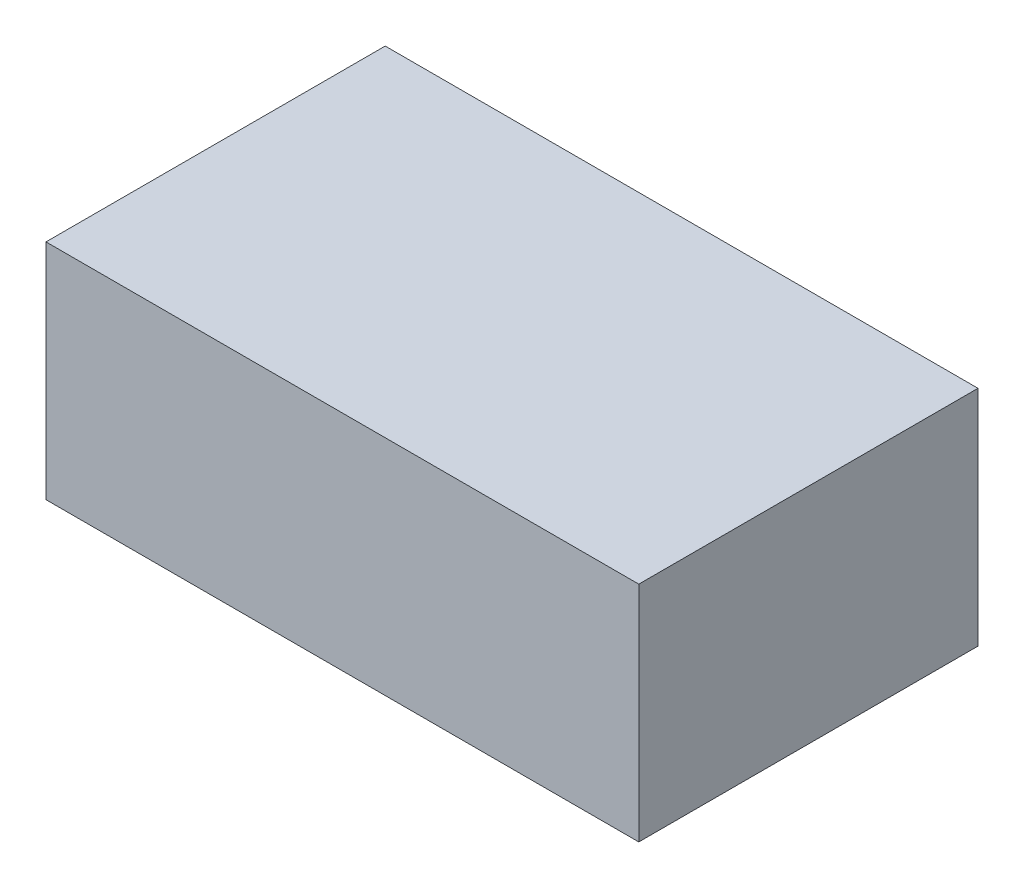
ISO-10303-21;
HEADER;
FILE_DESCRIPTION(('STEP AP214'),'2;1');
FILE_NAME('part.step','',(''),(''),'','','');
FILE_SCHEMA(('AUTOMOTIVE_DESIGN { 1 0 10303 214 1 1 1 1 }'));
ENDSEC;
DATA;
#1=APPLICATION_CONTEXT('core data for automotive mechanical design processes');
#2=APPLICATION_PROTOCOL_DEFINITION('international standard','automotive_design',2000,#1);
#3=PRODUCT_CONTEXT('',#1,'mechanical');
#4=PRODUCT('Part','Part','',(#3));
#5=PRODUCT_RELATED_PRODUCT_CATEGORY('part','',(#4));
#6=PRODUCT_DEFINITION_FORMATION('','',#4);
#7=PRODUCT_DEFINITION_CONTEXT('part definition',#1,'design');
#8=PRODUCT_DEFINITION('design','',#6,#7);
#9=PRODUCT_DEFINITION_SHAPE('','',#8);
#10=(LENGTH_UNIT() NAMED_UNIT(*) SI_UNIT(.MILLI.,.METRE.));
#11=(NAMED_UNIT(*) PLANE_ANGLE_UNIT() SI_UNIT($,.RADIAN.));
#12=(NAMED_UNIT(*) SI_UNIT($,.STERADIAN.) SOLID_ANGLE_UNIT());
#13=UNCERTAINTY_MEASURE_WITH_UNIT(LENGTH_MEASURE(1.E-05),#10,'distance_accuracy_value','');
#14=(GEOMETRIC_REPRESENTATION_CONTEXT(3) GLOBAL_UNCERTAINTY_ASSIGNED_CONTEXT((#13)) GLOBAL_UNIT_ASSIGNED_CONTEXT((#10,
#11,#12)) REPRESENTATION_CONTEXT('',''));
#15=CARTESIAN_POINT('',(0.,0.,0.));
#16=DIRECTION('',(0.,0.,1.));
#17=DIRECTION('',(1.,0.,0.));
#18=AXIS2_PLACEMENT_3D('',#15,#16,#17);
#19=CARTESIAN_POINT('',(0.,17.2212,0.));
#20=DIRECTION('',(1.,0.,0.));
#21=DIRECTION('',(0.,0.,-1.));
#22=AXIS2_PLACEMENT_3D('',#19,#20,#21);
#23=PLANE('',#22);
#24=DIRECTION('',(0.,0.,1.));
#25=VECTOR('',#24,1.);
#26=CARTESIAN_POINT('',(0.,0.,0.));
#27=LINE('',#26,#25);
#28=CARTESIAN_POINT('',(0.,0.,0.));
#29=VERTEX_POINT('',#28);
#30=CARTESIAN_POINT('',(0.,0.,26.162));
#31=VERTEX_POINT('',#30);
#32=EDGE_CURVE('E101',#29,#31,#27,.T.);
#33=ORIENTED_EDGE('',*,*,#32,.T.);
#34=DIRECTION('',(0.,-1.,0.));
#35=VECTOR('',#34,1.);
#36=CARTESIAN_POINT('',(0.,17.2212,26.162));
#37=LINE('',#36,#35);
#38=CARTESIAN_POINT('',(0.,17.2212,26.162));
#39=VERTEX_POINT('',#38);
#40=EDGE_CURVE('E11',#39,#31,#37,.T.);
#41=ORIENTED_EDGE('',*,*,#40,.F.);
#42=DIRECTION('',(0.,0.,1.));
#43=VECTOR('',#42,1.);
#44=CARTESIAN_POINT('',(0.,17.2212,0.));
#45=LINE('',#44,#43);
#46=CARTESIAN_POINT('',(0.,17.2212,0.));
#47=VERTEX_POINT('',#46);
#48=EDGE_CURVE('E89',#47,#39,#45,.T.);
#49=ORIENTED_EDGE('',*,*,#48,.F.);
#50=DIRECTION('',(0.,-1.,0.));
#51=VECTOR('',#50,1.);
#52=CARTESIAN_POINT('',(0.,17.2212,0.));
#53=LINE('',#52,#51);
#54=EDGE_CURVE('E97',#47,#29,#53,.T.);
#55=ORIENTED_EDGE('',*,*,#54,.T.);
#56=EDGE_LOOP('',(#33,#41,#49,#55));
#57=FACE_BOUND('',#56,.T.);
#58=ADVANCED_FACE('F38',(#57),#23,.F.);
#59=CARTESIAN_POINT('',(0.,17.2212,26.162));
#60=DIRECTION('',(0.,0.,-1.));
#61=DIRECTION('',(-1.,0.,0.));
#62=AXIS2_PLACEMENT_3D('',#59,#60,#61);
#63=PLANE('',#62);
#64=DIRECTION('',(1.,0.,0.));
#65=VECTOR('',#64,1.);
#66=CARTESIAN_POINT('',(0.,0.,26.162));
#67=LINE('',#66,#65);
#68=CARTESIAN_POINT('',(45.72,0.,26.162));
#69=VERTEX_POINT('',#68);
#70=EDGE_CURVE('E93',#31,#69,#67,.T.);
#71=ORIENTED_EDGE('',*,*,#70,.T.);
#72=DIRECTION('',(0.,-1.,0.));
#73=VECTOR('',#72,1.);
#74=CARTESIAN_POINT('',(45.72,17.2212,26.162));
#75=LINE('',#74,#73);
#76=CARTESIAN_POINT('',(45.72,17.2212,26.162));
#77=VERTEX_POINT('',#76);
#78=EDGE_CURVE('E46',#77,#69,#75,.T.);
#79=ORIENTED_EDGE('',*,*,#78,.F.);
#80=DIRECTION('',(1.,0.,0.));
#81=VECTOR('',#80,1.);
#82=CARTESIAN_POINT('',(0.,17.2212,26.162));
#83=LINE('',#82,#81);
#84=EDGE_CURVE('E84',#39,#77,#83,.T.);
#85=ORIENTED_EDGE('',*,*,#84,.F.);
#86=ORIENTED_EDGE('',*,*,#40,.T.);
#87=EDGE_LOOP('',(#71,#79,#85,#86));
#88=FACE_BOUND('',#87,.T.);
#89=ADVANCED_FACE('F92',(#88),#63,.F.);
#90=CARTESIAN_POINT('',(45.72,17.2212,0.));
#91=DIRECTION('',(-1.,0.,0.));
#92=DIRECTION('',(0.,0.,1.));
#93=AXIS2_PLACEMENT_3D('',#90,#91,#92);
#94=PLANE('',#93);
#95=DIRECTION('',(0.,0.,-1.));
#96=VECTOR('',#95,1.);
#97=CARTESIAN_POINT('',(45.72,0.,0.));
#98=LINE('',#97,#96);
#99=CARTESIAN_POINT('',(45.72,0.,0.));
#100=VERTEX_POINT('',#99);
#101=EDGE_CURVE('E71',#69,#100,#98,.T.);
#102=ORIENTED_EDGE('',*,*,#101,.T.);
#103=DIRECTION('',(0.,-1.,0.));
#104=VECTOR('',#103,1.);
#105=CARTESIAN_POINT('',(45.72,17.2212,0.));
#106=LINE('',#105,#104);
#107=CARTESIAN_POINT('',(45.72,17.2212,0.));
#108=VERTEX_POINT('',#107);
#109=EDGE_CURVE('E94',#108,#100,#106,.T.);
#110=ORIENTED_EDGE('',*,*,#109,.F.);
#111=DIRECTION('',(0.,0.,-1.));
#112=VECTOR('',#111,1.);
#113=CARTESIAN_POINT('',(45.72,17.2212,0.));
#114=LINE('',#113,#112);
#115=EDGE_CURVE('E87',#77,#108,#114,.T.);
#116=ORIENTED_EDGE('',*,*,#115,.F.);
#117=ORIENTED_EDGE('',*,*,#78,.T.);
#118=EDGE_LOOP('',(#102,#110,#116,#117));
#119=FACE_BOUND('',#118,.T.);
#120=ADVANCED_FACE('F95',(#119),#94,.F.);
#121=CARTESIAN_POINT('',(0.,17.2212,0.));
#122=DIRECTION('',(0.,0.,1.));
#123=DIRECTION('',(1.,0.,0.));
#124=AXIS2_PLACEMENT_3D('',#121,#122,#123);
#125=PLANE('',#124);
#126=DIRECTION('',(-1.,0.,0.));
#127=VECTOR('',#126,1.);
#128=CARTESIAN_POINT('',(0.,0.,0.));
#129=LINE('',#128,#127);
#130=EDGE_CURVE('E77',#100,#29,#129,.T.);
#131=ORIENTED_EDGE('',*,*,#130,.T.);
#132=ORIENTED_EDGE('',*,*,#54,.F.);
#133=DIRECTION('',(-1.,0.,0.));
#134=VECTOR('',#133,1.);
#135=CARTESIAN_POINT('',(0.,17.2212,0.));
#136=LINE('',#135,#134);
#137=EDGE_CURVE('E54',#108,#47,#136,.T.);
#138=ORIENTED_EDGE('',*,*,#137,.F.);
#139=ORIENTED_EDGE('',*,*,#109,.T.);
#140=EDGE_LOOP('',(#131,#132,#138,#139));
#141=FACE_BOUND('',#140,.T.);
#142=ADVANCED_FACE('F108',(#141),#125,.F.);
#143=CARTESIAN_POINT('',(0.,17.2212,0.));
#144=DIRECTION('',(0.,1.,0.));
#145=DIRECTION('',(0.,0.,1.));
#146=AXIS2_PLACEMENT_3D('',#143,#144,#145);
#147=PLANE('',#146);
#148=ORIENTED_EDGE('',*,*,#48,.T.);
#149=ORIENTED_EDGE('',*,*,#84,.T.);
#150=ORIENTED_EDGE('',*,*,#115,.T.);
#151=ORIENTED_EDGE('',*,*,#137,.T.);
#152=EDGE_LOOP('',(#148,#149,#150,#151));
#153=FACE_BOUND('',#152,.T.);
#154=ADVANCED_FACE('F85',(#153),#147,.T.);
#155=CARTESIAN_POINT('',(0.,0.,0.));
#156=DIRECTION('',(0.,1.,0.));
#157=DIRECTION('',(0.,0.,1.));
#158=AXIS2_PLACEMENT_3D('',#155,#156,#157);
#159=PLANE('',#158);
#160=ORIENTED_EDGE('',*,*,#32,.F.);
#161=ORIENTED_EDGE('',*,*,#130,.F.);
#162=ORIENTED_EDGE('',*,*,#101,.F.);
#163=ORIENTED_EDGE('',*,*,#70,.F.);
#164=EDGE_LOOP('',(#160,#161,#162,#163));
#165=FACE_BOUND('',#164,.T.);
#166=ADVANCED_FACE('F111',(#165),#159,.F.);
#167=CLOSED_SHELL('',(#58,#89,#120,#142,#154,#166));
#168=MANIFOLD_SOLID_BREP('B2',#167);
#169=ADVANCED_BREP_SHAPE_REPRESENTATION('',(#18,#168),#14);
#170=SHAPE_DEFINITION_REPRESENTATION(#9,#169);
ENDSEC;
END-ISO-10303-21;
